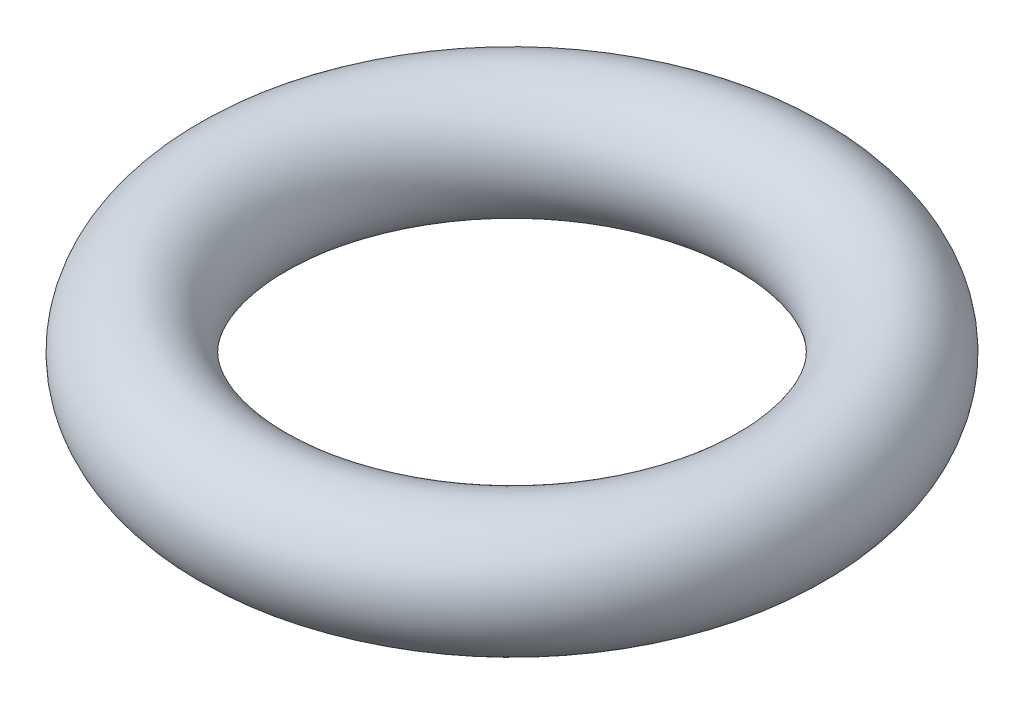
ISO-10303-21;
HEADER;
FILE_DESCRIPTION(('STEP AP214'),'2;1');
FILE_NAME('part.step','',(''),(''),'','','');
FILE_SCHEMA(('AUTOMOTIVE_DESIGN { 1 0 10303 214 1 1 1 1 }'));
ENDSEC;
DATA;
#1=APPLICATION_CONTEXT('core data for automotive mechanical design processes');
#2=APPLICATION_PROTOCOL_DEFINITION('international standard','automotive_design',2000,#1);
#3=PRODUCT_CONTEXT('',#1,'mechanical');
#4=PRODUCT('Part','Part','',(#3));
#5=PRODUCT_RELATED_PRODUCT_CATEGORY('part','',(#4));
#6=PRODUCT_DEFINITION_FORMATION('','',#4);
#7=PRODUCT_DEFINITION_CONTEXT('part definition',#1,'design');
#8=PRODUCT_DEFINITION('design','',#6,#7);
#9=PRODUCT_DEFINITION_SHAPE('','',#8);
#10=(LENGTH_UNIT() NAMED_UNIT(*) SI_UNIT(.MILLI.,.METRE.));
#11=(NAMED_UNIT(*) PLANE_ANGLE_UNIT() SI_UNIT($,.RADIAN.));
#12=(NAMED_UNIT(*) SI_UNIT($,.STERADIAN.) SOLID_ANGLE_UNIT());
#13=UNCERTAINTY_MEASURE_WITH_UNIT(LENGTH_MEASURE(1.E-05),#10,'distance_accuracy_value','');
#14=(GEOMETRIC_REPRESENTATION_CONTEXT(3) GLOBAL_UNCERTAINTY_ASSIGNED_CONTEXT((#13)) GLOBAL_UNIT_ASSIGNED_CONTEXT((#10,
#11,#12)) REPRESENTATION_CONTEXT('',''));
#15=CARTESIAN_POINT('',(0.,0.,0.));
#16=DIRECTION('',(0.,0.,1.));
#17=DIRECTION('',(1.,0.,0.));
#18=AXIS2_PLACEMENT_3D('',#15,#16,#17);
#19=CARTESIAN_POINT('',(0.,0.,0.));
#20=DIRECTION('',(0.,1.,0.));
#21=DIRECTION('',(0.,0.,1.));
#22=AXIS2_PLACEMENT_3D('',#19,#20,#21);
#23=TOROIDAL_SURFACE('',#22,1.9685,0.444499999999997);
#24=CARTESIAN_POINT('',(0.,0.,2.41299999999999));
#25=VERTEX_POINT('',#24);
#26=VERTEX_LOOP('',#25);
#27=FACE_BOUND('',#26,.T.);
#28=ADVANCED_FACE('F28',(#27),#23,.T.);
#29=CLOSED_SHELL('',(#28));
#30=MANIFOLD_SOLID_BREP('B2',#29);
#31=ADVANCED_BREP_SHAPE_REPRESENTATION('',(#18,#30),#14);
#32=SHAPE_DEFINITION_REPRESENTATION(#9,#31);
ENDSEC;
END-ISO-10303-21;
